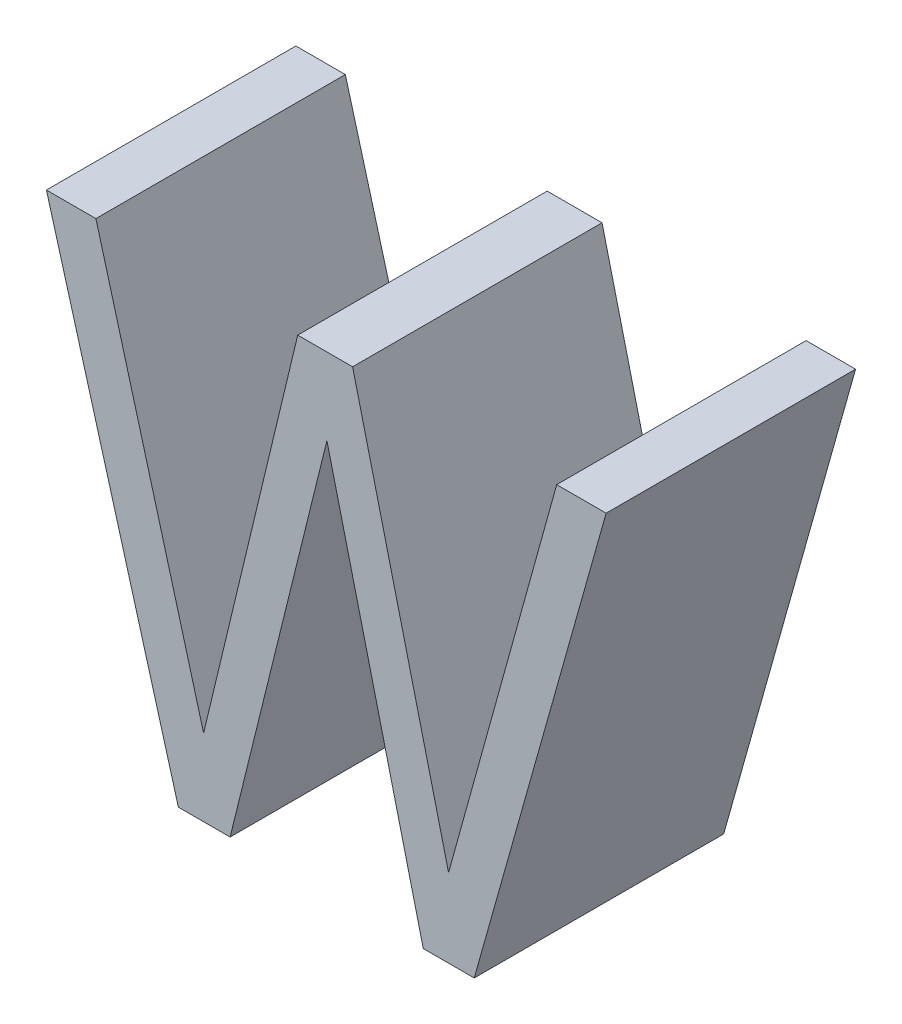
ISO-10303-21;
HEADER;
FILE_DESCRIPTION(('STEP AP214'),'2;1');
FILE_NAME('part.step','',(''),(''),'','','');
FILE_SCHEMA(('AUTOMOTIVE_DESIGN { 1 0 10303 214 1 1 1 1 }'));
ENDSEC;
DATA;
#1=APPLICATION_CONTEXT('core data for automotive mechanical design processes');
#2=APPLICATION_PROTOCOL_DEFINITION('international standard','automotive_design',2000,#1);
#3=PRODUCT_CONTEXT('',#1,'mechanical');
#4=PRODUCT('Part','Part','',(#3));
#5=PRODUCT_RELATED_PRODUCT_CATEGORY('part','',(#4));
#6=PRODUCT_DEFINITION_FORMATION('','',#4);
#7=PRODUCT_DEFINITION_CONTEXT('part definition',#1,'design');
#8=PRODUCT_DEFINITION('design','',#6,#7);
#9=PRODUCT_DEFINITION_SHAPE('','',#8);
#10=(LENGTH_UNIT() NAMED_UNIT(*) SI_UNIT(.MILLI.,.METRE.));
#11=(NAMED_UNIT(*) PLANE_ANGLE_UNIT() SI_UNIT($,.RADIAN.));
#12=(NAMED_UNIT(*) SI_UNIT($,.STERADIAN.) SOLID_ANGLE_UNIT());
#13=UNCERTAINTY_MEASURE_WITH_UNIT(LENGTH_MEASURE(1.E-05),#10,'distance_accuracy_value','');
#14=(GEOMETRIC_REPRESENTATION_CONTEXT(3) GLOBAL_UNCERTAINTY_ASSIGNED_CONTEXT((#13)) GLOBAL_UNIT_ASSIGNED_CONTEXT((#10,
#11,#12)) REPRESENTATION_CONTEXT('',''));
#15=CARTESIAN_POINT('',(0.,0.,0.));
#16=DIRECTION('',(0.,0.,1.));
#17=DIRECTION('',(1.,0.,0.));
#18=AXIS2_PLACEMENT_3D('',#15,#16,#17);
#19=CARTESIAN_POINT('',(2.654325952166,-5.151395190115,-5.5));
#20=DIRECTION('',(0.,0.,1.));
#21=DIRECTION('',(0.,-1.,0.));
#22=AXIS2_PLACEMENT_3D('',#19,#20,#21);
#23=PLANE('',#22);
#24=DIRECTION('',(0.271023852229595,0.962572631816753,0.));
#25=VECTOR('',#24,1.);
#26=CARTESIAN_POINT('',(3.248169486365,-6.13847583919,-5.5));
#27=LINE('',#26,#25);
#28=CARTESIAN_POINT('',(3.248169486365,-6.13847583919,-5.5));
#29=VERTEX_POINT('',#28);
#30=CARTESIAN_POINT('',(3.777008775254,-4.260241794746,-5.5));
#31=VERTEX_POINT('',#30);
#32=EDGE_CURVE('E153',#29,#31,#27,.T.);
#33=ORIENTED_EDGE('',*,*,#32,.T.);
#34=DIRECTION('',(-1.,0.,0.));
#35=VECTOR('',#34,1.);
#36=CARTESIAN_POINT('',(3.777008775254,-4.260241794746,-5.5));
#37=LINE('',#36,#35);
#38=CARTESIAN_POINT('',(3.578829508588,-4.260241794746,-5.5));
#39=VERTEX_POINT('',#38);
#40=EDGE_CURVE('E200',#31,#39,#37,.T.);
#41=ORIENTED_EDGE('',*,*,#40,.T.);
#42=DIRECTION('',(-0.267157652619448,-0.963652836163972,0.));
#43=VECTOR('',#42,1.);
#44=CARTESIAN_POINT('',(3.578829508588,-4.260241794746,-5.5));
#45=LINE('',#44,#43);
#46=CARTESIAN_POINT('',(3.145307953032,-5.823978683634,-5.5));
#47=VERTEX_POINT('',#46);
#48=EDGE_CURVE('E172',#39,#47,#45,.T.);
#49=ORIENTED_EDGE('',*,*,#48,.T.);
#50=DIRECTION('',(-0.238880368514266,0.971049004704957,0.));
#51=VECTOR('',#50,1.);
#52=CARTESIAN_POINT('',(3.145307953032,-5.823978683634,-5.5));
#53=LINE('',#52,#51);
#54=CARTESIAN_POINT('',(2.760624953032,-4.260241794746,-5.5));
#55=VERTEX_POINT('',#54);
#56=EDGE_CURVE('E139',#47,#55,#53,.T.);
#57=ORIENTED_EDGE('',*,*,#56,.T.);
#58=DIRECTION('',(-1.,0.,0.));
#59=VECTOR('',#58,1.);
#60=CARTESIAN_POINT('',(2.760624953032,-4.260241794746,-5.5));
#61=LINE('',#60,#59);
#62=CARTESIAN_POINT('',(2.540579108588,-4.260241794746,-5.5));
#63=VERTEX_POINT('',#62);
#64=EDGE_CURVE('E123',#55,#63,#61,.T.);
#65=ORIENTED_EDGE('',*,*,#64,.T.);
#66=DIRECTION('',(-0.233602915926146,-0.972332081991951,0.));
#67=VECTOR('',#66,1.);
#68=CARTESIAN_POINT('',(2.540579108588,-4.260241794746,-5.5));
#69=LINE('',#68,#67);
#70=CARTESIAN_POINT('',(2.163253641921,-5.830794350301,-5.5));
#71=VERTEX_POINT('',#70);
#72=EDGE_CURVE('E129',#63,#71,#69,.T.);
#73=ORIENTED_EDGE('',*,*,#72,.T.);
#74=DIRECTION('',(-0.265095068840509,0.964222279599702,0.));
#75=VECTOR('',#74,1.);
#76=CARTESIAN_POINT('',(2.163253641921,-5.830794350301,-5.5));
#77=LINE('',#76,#75);
#78=CARTESIAN_POINT('',(1.731459286365,-4.260241794746,-5.5));
#79=VERTEX_POINT('',#78);
#80=EDGE_CURVE('E159',#71,#79,#77,.T.);
#81=ORIENTED_EDGE('',*,*,#80,.T.);
#82=DIRECTION('',(-1.,0.,0.));
#83=VECTOR('',#82,1.);
#84=CARTESIAN_POINT('',(1.731459286365,-4.260241794746,-5.5));
#85=LINE('',#84,#83);
#86=CARTESIAN_POINT('',(1.533144553032,-4.260241794746,-5.5));
#87=VERTEX_POINT('',#86);
#88=EDGE_CURVE('E195',#79,#87,#85,.T.);
#89=ORIENTED_EDGE('',*,*,#88,.T.);
#90=DIRECTION('',(0.271086835887725,-0.962554895789524,0.));
#91=VECTOR('',#90,1.);
#92=CARTESIAN_POINT('',(1.533144553032,-4.260241794746,-5.5));
#93=LINE('',#92,#91);
#94=CARTESIAN_POINT('',(2.062116486365,-6.13847583919,-5.5));
#95=VERTEX_POINT('',#94);
#96=EDGE_CURVE('E164',#87,#95,#93,.T.);
#97=ORIENTED_EDGE('',*,*,#96,.T.);
#98=DIRECTION('',(1.,0.,0.));
#99=VECTOR('',#98,1.);
#100=CARTESIAN_POINT('',(2.062116486365,-6.13847583919,-5.5));
#101=LINE('',#100,#99);
#102=CARTESIAN_POINT('',(2.269510308588,-6.13847583919,-5.5));
#103=VERTEX_POINT('',#102);
#104=EDGE_CURVE('E192',#95,#103,#101,.T.);
#105=ORIENTED_EDGE('',*,*,#104,.T.);
#106=DIRECTION('',(0.239885373279573,0.97080121945047,0.));
#107=VECTOR('',#106,1.);
#108=CARTESIAN_POINT('',(2.269510308588,-6.13847583919,-5.5));
#109=LINE('',#108,#107);
#110=CARTESIAN_POINT('',(2.657627953032,-4.567787816968,-5.5));
#111=VERTEX_POINT('',#110);
#112=EDGE_CURVE('E178',#103,#111,#109,.T.);
#113=ORIENTED_EDGE('',*,*,#112,.T.);
#114=DIRECTION('',(0.238808134887944,-0.971066771499953,0.));
#115=VECTOR('',#114,1.);
#116=CARTESIAN_POINT('',(2.657627953032,-4.567787816968,-5.5));
#117=LINE('',#116,#115);
#118=CARTESIAN_POINT('',(3.043897041921,-6.13847583919,-5.5));
#119=VERTEX_POINT('',#118);
#120=EDGE_CURVE('E228',#111,#119,#117,.T.);
#121=ORIENTED_EDGE('',*,*,#120,.T.);
#122=DIRECTION('',(1.,0.,0.));
#123=VECTOR('',#122,1.);
#124=CARTESIAN_POINT('',(3.043897041921,-6.13847583919,-5.5));
#125=LINE('',#124,#123);
#126=EDGE_CURVE('E11',#119,#29,#125,.T.);
#127=ORIENTED_EDGE('',*,*,#126,.T.);
#128=EDGE_LOOP('',(#33,#41,#49,#57,#65,#73,#81,#89,#97,#105,#113,#121,#127));
#129=FACE_BOUND('',#128,.T.);
#130=ADVANCED_FACE('F16',(#129),#23,.T.);
#131=CARTESIAN_POINT('',(2.654325952166,-5.151395190115,-6.5));
#132=DIRECTION('',(0.,0.,1.));
#133=DIRECTION('',(0.,-1.,0.));
#134=AXIS2_PLACEMENT_3D('',#131,#132,#133);
#135=PLANE('',#134);
#136=DIRECTION('',(0.271023852229595,0.962572631816753,0.));
#137=VECTOR('',#136,1.);
#138=CARTESIAN_POINT('',(3.248169486365,-6.13847583919,-6.5));
#139=LINE('',#138,#137);
#140=CARTESIAN_POINT('',(3.248169486365,-6.13847583919,-6.5));
#141=VERTEX_POINT('',#140);
#142=CARTESIAN_POINT('',(3.777008775254,-4.260241794746,-6.5));
#143=VERTEX_POINT('',#142);
#144=EDGE_CURVE('E221',#141,#143,#139,.T.);
#145=ORIENTED_EDGE('',*,*,#144,.F.);
#146=DIRECTION('',(1.,0.,0.));
#147=VECTOR('',#146,1.);
#148=CARTESIAN_POINT('',(3.043897041921,-6.13847583919,-6.5));
#149=LINE('',#148,#147);
#150=CARTESIAN_POINT('',(3.043897041921,-6.13847583919,-6.5));
#151=VERTEX_POINT('',#150);
#152=EDGE_CURVE('E27',#151,#141,#149,.T.);
#153=ORIENTED_EDGE('',*,*,#152,.F.);
#154=DIRECTION('',(0.238808134887944,-0.971066771499953,0.));
#155=VECTOR('',#154,1.);
#156=CARTESIAN_POINT('',(2.657627953032,-4.567787816968,-6.5));
#157=LINE('',#156,#155);
#158=CARTESIAN_POINT('',(2.657627953032,-4.567787816968,-6.5));
#159=VERTEX_POINT('',#158);
#160=EDGE_CURVE('E182',#159,#151,#157,.T.);
#161=ORIENTED_EDGE('',*,*,#160,.F.);
#162=DIRECTION('',(0.239885373279573,0.97080121945047,0.));
#163=VECTOR('',#162,1.);
#164=CARTESIAN_POINT('',(2.269510308588,-6.13847583919,-6.5));
#165=LINE('',#164,#163);
#166=CARTESIAN_POINT('',(2.269510308588,-6.13847583919,-6.5));
#167=VERTEX_POINT('',#166);
#168=EDGE_CURVE('E188',#167,#159,#165,.T.);
#169=ORIENTED_EDGE('',*,*,#168,.F.);
#170=DIRECTION('',(1.,0.,0.));
#171=VECTOR('',#170,1.);
#172=CARTESIAN_POINT('',(2.062116486365,-6.13847583919,-6.5));
#173=LINE('',#172,#171);
#174=CARTESIAN_POINT('',(2.062116486365,-6.13847583919,-6.5));
#175=VERTEX_POINT('',#174);
#176=EDGE_CURVE('E174',#175,#167,#173,.T.);
#177=ORIENTED_EDGE('',*,*,#176,.F.);
#178=DIRECTION('',(0.271086835887725,-0.962554895789524,0.));
#179=VECTOR('',#178,1.);
#180=CARTESIAN_POINT('',(1.533144553032,-4.260241794746,-6.5));
#181=LINE('',#180,#179);
#182=CARTESIAN_POINT('',(1.533144553032,-4.260241794746,-6.5));
#183=VERTEX_POINT('',#182);
#184=EDGE_CURVE('E165',#183,#175,#181,.T.);
#185=ORIENTED_EDGE('',*,*,#184,.F.);
#186=DIRECTION('',(-1.,0.,0.));
#187=VECTOR('',#186,1.);
#188=CARTESIAN_POINT('',(1.731459286365,-4.260241794746,-6.5));
#189=LINE('',#188,#187);
#190=CARTESIAN_POINT('',(1.731459286365,-4.260241794746,-6.5));
#191=VERTEX_POINT('',#190);
#192=EDGE_CURVE('E210',#191,#183,#189,.T.);
#193=ORIENTED_EDGE('',*,*,#192,.F.);
#194=DIRECTION('',(-0.265095068840509,0.964222279599702,0.));
#195=VECTOR('',#194,1.);
#196=CARTESIAN_POINT('',(2.163253641921,-5.830794350301,-6.5));
#197=LINE('',#196,#195);
#198=CARTESIAN_POINT('',(2.163253641921,-5.830794350301,-6.5));
#199=VERTEX_POINT('',#198);
#200=EDGE_CURVE('E117',#199,#191,#197,.T.);
#201=ORIENTED_EDGE('',*,*,#200,.F.);
#202=DIRECTION('',(-0.233602915926146,-0.972332081991951,0.));
#203=VECTOR('',#202,1.);
#204=CARTESIAN_POINT('',(2.540579108588,-4.260241794746,-6.5));
#205=LINE('',#204,#203);
#206=CARTESIAN_POINT('',(2.540579108588,-4.260241794746,-6.5));
#207=VERTEX_POINT('',#206);
#208=EDGE_CURVE('E107',#207,#199,#205,.T.);
#209=ORIENTED_EDGE('',*,*,#208,.F.);
#210=DIRECTION('',(-1.,0.,0.));
#211=VECTOR('',#210,1.);
#212=CARTESIAN_POINT('',(2.760624953032,-4.260241794746,-6.5));
#213=LINE('',#212,#211);
#214=CARTESIAN_POINT('',(2.760624953032,-4.260241794746,-6.5));
#215=VERTEX_POINT('',#214);
#216=EDGE_CURVE('E113',#215,#207,#213,.T.);
#217=ORIENTED_EDGE('',*,*,#216,.F.);
#218=DIRECTION('',(-0.238880368514266,0.971049004704957,0.));
#219=VECTOR('',#218,1.);
#220=CARTESIAN_POINT('',(3.145307953032,-5.823978683634,-6.5));
#221=LINE('',#220,#219);
#222=CARTESIAN_POINT('',(3.145307953032,-5.823978683634,-6.5));
#223=VERTEX_POINT('',#222);
#224=EDGE_CURVE('E148',#223,#215,#221,.T.);
#225=ORIENTED_EDGE('',*,*,#224,.F.);
#226=DIRECTION('',(-0.267157652619448,-0.963652836163972,0.));
#227=VECTOR('',#226,1.);
#228=CARTESIAN_POINT('',(3.578829508588,-4.260241794746,-6.5));
#229=LINE('',#228,#227);
#230=CARTESIAN_POINT('',(3.578829508588,-4.260241794746,-6.5));
#231=VERTEX_POINT('',#230);
#232=EDGE_CURVE('E173',#231,#223,#229,.T.);
#233=ORIENTED_EDGE('',*,*,#232,.F.);
#234=DIRECTION('',(-1.,0.,0.));
#235=VECTOR('',#234,1.);
#236=CARTESIAN_POINT('',(3.777008775254,-4.260241794746,-6.5));
#237=LINE('',#236,#235);
#238=EDGE_CURVE('E150',#143,#231,#237,.T.);
#239=ORIENTED_EDGE('',*,*,#238,.F.);
#240=EDGE_LOOP('',(#145,#153,#161,#169,#177,#185,#193,#201,#209,#217,#225,#233,#239));
#241=FACE_BOUND('',#240,.T.);
#242=ADVANCED_FACE('F110',(#241),#135,.F.);
#243=CARTESIAN_POINT('',(3.146033264143,-6.13847583919,-5.49));
#244=DIRECTION('',(0.,1.,0.));
#245=DIRECTION('',(-1.,0.,0.));
#246=AXIS2_PLACEMENT_3D('',#243,#244,#245);
#247=PLANE('',#246);
#248=DIRECTION('',(0.,0.,1.));
#249=VECTOR('',#248,1.);
#250=CARTESIAN_POINT('',(3.043897041921,-6.13847583919,-6.5));
#251=LINE('',#250,#249);
#252=EDGE_CURVE('E187',#151,#119,#251,.T.);
#253=ORIENTED_EDGE('',*,*,#252,.F.);
#254=ORIENTED_EDGE('',*,*,#152,.T.);
#255=DIRECTION('',(0.,0.,1.));
#256=VECTOR('',#255,1.);
#257=CARTESIAN_POINT('',(3.248169486365,-6.13847583919,-6.5));
#258=LINE('',#257,#256);
#259=EDGE_CURVE('E431',#141,#29,#258,.T.);
#260=ORIENTED_EDGE('',*,*,#259,.T.);
#261=ORIENTED_EDGE('',*,*,#126,.F.);
#262=EDGE_LOOP('',(#253,#254,#260,#261));
#263=FACE_BOUND('',#262,.T.);
#264=ADVANCED_FACE('F349',(#263),#247,.F.);
#265=CARTESIAN_POINT('',(2.8507624974765,-5.353131828079,-5.49));
#266=DIRECTION('',(0.971066771499953,0.238808134887944,0.));
#267=DIRECTION('',(0.,0.,-1.));
#268=AXIS2_PLACEMENT_3D('',#265,#266,#267);
#269=PLANE('',#268);
#270=DIRECTION('',(0.,0.,1.));
#271=VECTOR('',#270,1.);
#272=CARTESIAN_POINT('',(2.657627953032,-4.567787816968,-6.5));
#273=LINE('',#272,#271);
#274=EDGE_CURVE('E183',#159,#111,#273,.T.);
#275=ORIENTED_EDGE('',*,*,#274,.F.);
#276=ORIENTED_EDGE('',*,*,#160,.T.);
#277=ORIENTED_EDGE('',*,*,#252,.T.);
#278=ORIENTED_EDGE('',*,*,#120,.F.);
#279=EDGE_LOOP('',(#275,#276,#277,#278));
#280=FACE_BOUND('',#279,.T.);
#281=ADVANCED_FACE('F344',(#280),#269,.F.);
#282=CARTESIAN_POINT('',(2.46356913081,-5.353131828079,-5.49));
#283=DIRECTION('',(-0.97080121945047,0.239885373279574,0.));
#284=DIRECTION('',(0.,0.,1.));
#285=AXIS2_PLACEMENT_3D('',#282,#283,#284);
#286=PLANE('',#285);
#287=DIRECTION('',(0.,0.,1.));
#288=VECTOR('',#287,1.);
#289=CARTESIAN_POINT('',(2.269510308588,-6.13847583919,-6.5));
#290=LINE('',#289,#288);
#291=EDGE_CURVE('E20',#167,#103,#290,.T.);
#292=ORIENTED_EDGE('',*,*,#291,.F.);
#293=ORIENTED_EDGE('',*,*,#168,.T.);
#294=ORIENTED_EDGE('',*,*,#274,.T.);
#295=ORIENTED_EDGE('',*,*,#112,.F.);
#296=EDGE_LOOP('',(#292,#293,#294,#295));
#297=FACE_BOUND('',#296,.T.);
#298=ADVANCED_FACE('F336',(#297),#286,.F.);
#299=CARTESIAN_POINT('',(2.1658133974765,-6.13847583919,-5.49));
#300=DIRECTION('',(0.,1.,0.));
#301=DIRECTION('',(-1.,0.,0.));
#302=AXIS2_PLACEMENT_3D('',#299,#300,#301);
#303=PLANE('',#302);
#304=DIRECTION('',(0.,0.,1.));
#305=VECTOR('',#304,1.);
#306=CARTESIAN_POINT('',(2.062116486365,-6.13847583919,-6.5));
#307=LINE('',#306,#305);
#308=EDGE_CURVE('E160',#175,#95,#307,.T.);
#309=ORIENTED_EDGE('',*,*,#308,.F.);
#310=ORIENTED_EDGE('',*,*,#176,.T.);
#311=ORIENTED_EDGE('',*,*,#291,.T.);
#312=ORIENTED_EDGE('',*,*,#104,.F.);
#313=EDGE_LOOP('',(#309,#310,#311,#312));
#314=FACE_BOUND('',#313,.T.);
#315=ADVANCED_FACE('F330',(#314),#303,.F.);
#316=CARTESIAN_POINT('',(1.7976305196985,-5.199358816968,-5.49));
#317=DIRECTION('',(0.962554895789524,0.271086835887725,0.));
#318=DIRECTION('',(0.,0.,-1.));
#319=AXIS2_PLACEMENT_3D('',#316,#317,#318);
#320=PLANE('',#319);
#321=DIRECTION('',(0.,0.,1.));
#322=VECTOR('',#321,1.);
#323=CARTESIAN_POINT('',(1.533144553032,-4.260241794746,-6.5));
#324=LINE('',#323,#322);
#325=EDGE_CURVE('E199',#183,#87,#324,.T.);
#326=ORIENTED_EDGE('',*,*,#325,.F.);
#327=ORIENTED_EDGE('',*,*,#184,.T.);
#328=ORIENTED_EDGE('',*,*,#308,.T.);
#329=ORIENTED_EDGE('',*,*,#96,.F.);
#330=EDGE_LOOP('',(#326,#327,#328,#329));
#331=FACE_BOUND('',#330,.T.);
#332=ADVANCED_FACE('F335',(#331),#320,.F.);
#333=CARTESIAN_POINT('',(1.6323019196985,-4.260241794746,-5.49));
#334=DIRECTION('',(0.,-1.,0.));
#335=DIRECTION('',(0.,0.,1.));
#336=AXIS2_PLACEMENT_3D('',#333,#334,#335);
#337=PLANE('',#336);
#338=DIRECTION('',(0.,0.,1.));
#339=VECTOR('',#338,1.);
#340=CARTESIAN_POINT('',(1.731459286365,-4.260241794746,-6.5));
#341=LINE('',#340,#339);
#342=EDGE_CURVE('E155',#191,#79,#341,.T.);
#343=ORIENTED_EDGE('',*,*,#342,.F.);
#344=ORIENTED_EDGE('',*,*,#192,.T.);
#345=ORIENTED_EDGE('',*,*,#325,.T.);
#346=ORIENTED_EDGE('',*,*,#88,.F.);
#347=EDGE_LOOP('',(#343,#344,#345,#346));
#348=FACE_BOUND('',#347,.T.);
#349=ADVANCED_FACE('F298',(#348),#337,.F.);
#350=CARTESIAN_POINT('',(1.947356464143,-5.0455180725235,-5.49));
#351=DIRECTION('',(-0.964222279599702,-0.265095068840509,0.));
#352=DIRECTION('',(0.,0.,1.));
#353=AXIS2_PLACEMENT_3D('',#350,#351,#352);
#354=PLANE('',#353);
#355=DIRECTION('',(0.,0.,1.));
#356=VECTOR('',#355,1.);
#357=CARTESIAN_POINT('',(2.163253641921,-5.830794350301,-6.5));
#358=LINE('',#357,#356);
#359=EDGE_CURVE('E122',#199,#71,#358,.T.);
#360=ORIENTED_EDGE('',*,*,#359,.F.);
#361=ORIENTED_EDGE('',*,*,#200,.T.);
#362=ORIENTED_EDGE('',*,*,#342,.T.);
#363=ORIENTED_EDGE('',*,*,#80,.F.);
#364=EDGE_LOOP('',(#360,#361,#362,#363));
#365=FACE_BOUND('',#364,.T.);
#366=ADVANCED_FACE('F240',(#365),#354,.F.);
#367=CARTESIAN_POINT('',(2.3519163752545,-5.0455180725235,-5.49));
#368=DIRECTION('',(0.972332081991951,-0.233602915926146,0.));
#369=DIRECTION('',(0.233602915926146,0.972332081991951,0.));
#370=AXIS2_PLACEMENT_3D('',#367,#368,#369);
#371=PLANE('',#370);
#372=DIRECTION('',(0.,0.,1.));
#373=VECTOR('',#372,1.);
#374=CARTESIAN_POINT('',(2.540579108588,-4.260241794746,-6.5));
#375=LINE('',#374,#373);
#376=EDGE_CURVE('E126',#207,#63,#375,.T.);
#377=ORIENTED_EDGE('',*,*,#376,.F.);
#378=ORIENTED_EDGE('',*,*,#208,.T.);
#379=ORIENTED_EDGE('',*,*,#359,.T.);
#380=ORIENTED_EDGE('',*,*,#72,.F.);
#381=EDGE_LOOP('',(#377,#378,#379,#380));
#382=FACE_BOUND('',#381,.T.);
#383=ADVANCED_FACE('F127',(#382),#371,.F.);
#384=CARTESIAN_POINT('',(2.65060203081,-4.260241794746,-5.49));
#385=DIRECTION('',(0.,-1.,0.));
#386=DIRECTION('',(0.,0.,1.));
#387=AXIS2_PLACEMENT_3D('',#384,#385,#386);
#388=PLANE('',#387);
#389=DIRECTION('',(0.,0.,1.));
#390=VECTOR('',#389,1.);
#391=CARTESIAN_POINT('',(2.760624953032,-4.260241794746,-6.5));
#392=LINE('',#391,#390);
#393=EDGE_CURVE('E136',#215,#55,#392,.T.);
#394=ORIENTED_EDGE('',*,*,#393,.F.);
#395=ORIENTED_EDGE('',*,*,#216,.T.);
#396=ORIENTED_EDGE('',*,*,#376,.T.);
#397=ORIENTED_EDGE('',*,*,#64,.F.);
#398=EDGE_LOOP('',(#394,#395,#396,#397));
#399=FACE_BOUND('',#398,.T.);
#400=ADVANCED_FACE('F134',(#399),#388,.F.);
#401=CARTESIAN_POINT('',(2.952966453032,-5.04211023919,-5.49));
#402=DIRECTION('',(-0.971049004704957,-0.238880368514266,0.));
#403=DIRECTION('',(0.,0.,1.));
#404=AXIS2_PLACEMENT_3D('',#401,#402,#403);
#405=PLANE('',#404);
#406=DIRECTION('',(0.,0.,1.));
#407=VECTOR('',#406,1.);
#408=CARTESIAN_POINT('',(3.145307953032,-5.823978683634,-6.5));
#409=LINE('',#408,#407);
#410=EDGE_CURVE('E168',#223,#47,#409,.T.);
#411=ORIENTED_EDGE('',*,*,#410,.F.);
#412=ORIENTED_EDGE('',*,*,#224,.T.);
#413=ORIENTED_EDGE('',*,*,#393,.T.);
#414=ORIENTED_EDGE('',*,*,#56,.F.);
#415=EDGE_LOOP('',(#411,#412,#413,#414));
#416=FACE_BOUND('',#415,.T.);
#417=ADVANCED_FACE('F304',(#416),#405,.F.);
#418=CARTESIAN_POINT('',(3.36206873081,-5.04211023919,-5.49));
#419=DIRECTION('',(0.963652836163972,-0.267157652619448,0.));
#420=DIRECTION('',(0.267157652619448,0.963652836163972,0.));
#421=AXIS2_PLACEMENT_3D('',#418,#419,#420);
#422=PLANE('',#421);
#423=DIRECTION('',(0.,0.,1.));
#424=VECTOR('',#423,1.);
#425=CARTESIAN_POINT('',(3.578829508588,-4.260241794746,-6.5));
#426=LINE('',#425,#424);
#427=EDGE_CURVE('E152',#231,#39,#426,.T.);
#428=ORIENTED_EDGE('',*,*,#427,.F.);
#429=ORIENTED_EDGE('',*,*,#232,.T.);
#430=ORIENTED_EDGE('',*,*,#410,.T.);
#431=ORIENTED_EDGE('',*,*,#48,.F.);
#432=EDGE_LOOP('',(#428,#429,#430,#431));
#433=FACE_BOUND('',#432,.T.);
#434=ADVANCED_FACE('F286',(#433),#422,.F.);
#435=CARTESIAN_POINT('',(3.677919141921,-4.260241794746,-5.49));
#436=DIRECTION('',(0.,-1.,0.));
#437=DIRECTION('',(0.,0.,1.));
#438=AXIS2_PLACEMENT_3D('',#435,#436,#437);
#439=PLANE('',#438);
#440=DIRECTION('',(0.,0.,1.));
#441=VECTOR('',#440,1.);
#442=CARTESIAN_POINT('',(3.777008775254,-4.260241794746,-6.5));
#443=LINE('',#442,#441);
#444=EDGE_CURVE('E217',#143,#31,#443,.T.);
#445=ORIENTED_EDGE('',*,*,#444,.F.);
#446=ORIENTED_EDGE('',*,*,#238,.T.);
#447=ORIENTED_EDGE('',*,*,#427,.T.);
#448=ORIENTED_EDGE('',*,*,#40,.F.);
#449=EDGE_LOOP('',(#445,#446,#447,#448));
#450=FACE_BOUND('',#449,.T.);
#451=ADVANCED_FACE('F18',(#450),#439,.F.);
#452=CARTESIAN_POINT('',(3.5125891308095,-5.199358816968,-5.49));
#453=DIRECTION('',(-0.962572631816753,0.271023852229595,0.));
#454=DIRECTION('',(0.,0.,1.));
#455=AXIS2_PLACEMENT_3D('',#452,#453,#454);
#456=PLANE('',#455);
#457=ORIENTED_EDGE('',*,*,#259,.F.);
#458=ORIENTED_EDGE('',*,*,#144,.T.);
#459=ORIENTED_EDGE('',*,*,#444,.T.);
#460=ORIENTED_EDGE('',*,*,#32,.F.);
#461=EDGE_LOOP('',(#457,#458,#459,#460));
#462=FACE_BOUND('',#461,.T.);
#463=ADVANCED_FACE('F285',(#462),#456,.F.);
#464=CLOSED_SHELL('',(#130,#242,#264,#281,#298,#315,#332,#349,#366,#383,#400,#417,#434,#451,#463));
#465=MANIFOLD_SOLID_BREP('B1',#464);
#466=ADVANCED_BREP_SHAPE_REPRESENTATION('',(#18,#465),#14);
#467=SHAPE_DEFINITION_REPRESENTATION(#9,#466);
ENDSEC;
END-ISO-10303-21;
